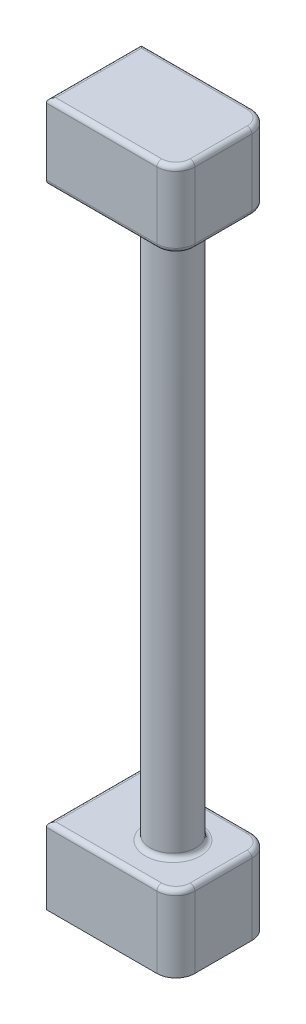
ISO-10303-21;
HEADER;
FILE_DESCRIPTION(('STEP AP214'),'2;1');
FILE_NAME('part.step','',(''),(''),'','','');
FILE_SCHEMA(('AUTOMOTIVE_DESIGN { 1 0 10303 214 1 1 1 1 }'));
ENDSEC;
DATA;
#1=APPLICATION_CONTEXT('core data for automotive mechanical design processes');
#2=APPLICATION_PROTOCOL_DEFINITION('international standard','automotive_design',2000,#1);
#3=PRODUCT_CONTEXT('',#1,'mechanical');
#4=PRODUCT('Part','Part','',(#3));
#5=PRODUCT_RELATED_PRODUCT_CATEGORY('part','',(#4));
#6=PRODUCT_DEFINITION_FORMATION('','',#4);
#7=PRODUCT_DEFINITION_CONTEXT('part definition',#1,'design');
#8=PRODUCT_DEFINITION('design','',#6,#7);
#9=PRODUCT_DEFINITION_SHAPE('','',#8);
#10=(LENGTH_UNIT() NAMED_UNIT(*) SI_UNIT(.MILLI.,.METRE.));
#11=(NAMED_UNIT(*) PLANE_ANGLE_UNIT() SI_UNIT($,.RADIAN.));
#12=(NAMED_UNIT(*) SI_UNIT($,.STERADIAN.) SOLID_ANGLE_UNIT());
#13=UNCERTAINTY_MEASURE_WITH_UNIT(LENGTH_MEASURE(1.E-05),#10,'distance_accuracy_value','');
#14=(GEOMETRIC_REPRESENTATION_CONTEXT(3) GLOBAL_UNCERTAINTY_ASSIGNED_CONTEXT((#13)) GLOBAL_UNIT_ASSIGNED_CONTEXT((#10,
#11,#12)) REPRESENTATION_CONTEXT('',''));
#15=CARTESIAN_POINT('',(0.,0.,0.));
#16=DIRECTION('',(0.,0.,1.));
#17=DIRECTION('',(1.,0.,0.));
#18=AXIS2_PLACEMENT_3D('',#15,#16,#17);
#19=CARTESIAN_POINT('',(0.,0.,0.));
#20=DIRECTION('',(0.,-1.,0.));
#21=DIRECTION('',(0.,0.,-1.));
#22=AXIS2_PLACEMENT_3D('',#19,#20,#21);
#23=CYLINDRICAL_SURFACE('',#22,12.);
#24=CARTESIAN_POINT('',(0.,42.5,0.));
#25=DIRECTION('',(0.,-1.,0.));
#26=DIRECTION('',(0.,0.,-1.));
#27=AXIS2_PLACEMENT_3D('',#24,#25,#26);
#28=CIRCLE('',#27,12.);
#29=CARTESIAN_POINT('',(0.,42.5,-12.));
#30=VERTEX_POINT('',#29);
#31=EDGE_CURVE('E293',#30,#30,#28,.F.);
#32=ORIENTED_EDGE('',*,*,#31,.T.);
#33=EDGE_LOOP('',(#32));
#34=FACE_BOUND('',#33,.T.);
#35=CARTESIAN_POINT('',(0.,327.5,0.));
#36=DIRECTION('',(0.,1.,0.));
#37=DIRECTION('',(0.,0.,1.));
#38=AXIS2_PLACEMENT_3D('',#35,#36,#37);
#39=CIRCLE('',#38,12.);
#40=CARTESIAN_POINT('',(0.,327.5,12.));
#41=VERTEX_POINT('',#40);
#42=EDGE_CURVE('E277',#41,#41,#39,.F.);
#43=ORIENTED_EDGE('',*,*,#42,.T.);
#44=EDGE_LOOP('',(#43));
#45=FACE_BOUND('',#44,.T.);
#46=ADVANCED_FACE('F32',(#34,#45),#23,.T.);
#47=CARTESIAN_POINT('',(-41.6342119381749,330.,25.));
#48=DIRECTION('',(-1.,0.,0.));
#49=DIRECTION('',(0.,0.,1.));
#50=AXIS2_PLACEMENT_3D('',#47,#48,#49);
#51=PLANE('',#50);
#52=DIRECTION('',(0.,1.,0.));
#53=VECTOR('',#52,1.);
#54=CARTESIAN_POINT('',(-41.6342119381749,330.,-25.));
#55=LINE('',#54,#53);
#56=CARTESIAN_POINT('',(-41.6342119381749,332.5,-25.));
#57=VERTEX_POINT('',#56);
#58=CARTESIAN_POINT('',(-41.6342119381749,367.5,-25.));
#59=VERTEX_POINT('',#58);
#60=EDGE_CURVE('E220',#57,#59,#55,.T.);
#61=ORIENTED_EDGE('',*,*,#60,.F.);
#62=DIRECTION('',(0.,0.,1.));
#63=VECTOR('',#62,1.);
#64=CARTESIAN_POINT('',(-41.6342119381749,332.5,25.));
#65=LINE('',#64,#63);
#66=CARTESIAN_POINT('',(-41.6342119381749,332.5,25.));
#67=VERTEX_POINT('',#66);
#68=EDGE_CURVE('E271',#57,#67,#65,.T.);
#69=ORIENTED_EDGE('',*,*,#68,.T.);
#70=DIRECTION('',(0.,1.,0.));
#71=VECTOR('',#70,1.);
#72=CARTESIAN_POINT('',(-41.6342119381749,330.,25.));
#73=LINE('',#72,#71);
#74=CARTESIAN_POINT('',(-41.6342119381749,367.5,25.));
#75=VERTEX_POINT('',#74);
#76=EDGE_CURVE('E216',#67,#75,#73,.T.);
#77=ORIENTED_EDGE('',*,*,#76,.T.);
#78=DIRECTION('',(0.,0.,1.));
#79=VECTOR('',#78,1.);
#80=CARTESIAN_POINT('',(-41.6342119381749,367.5,25.));
#81=LINE('',#80,#79);
#82=EDGE_CURVE('E269',#75,#59,#81,.F.);
#83=ORIENTED_EDGE('',*,*,#82,.T.);
#84=EDGE_LOOP('',(#61,#69,#77,#83));
#85=FACE_BOUND('',#84,.T.);
#86=ADVANCED_FACE('F406',(#85),#51,.T.);
#87=CARTESIAN_POINT('',(-31.7477646685832,330.,-25.));
#88=DIRECTION('',(0.,0.,-1.));
#89=DIRECTION('',(-1.,0.,0.));
#90=AXIS2_PLACEMENT_3D('',#87,#88,#89);
#91=PLANE('',#90);
#92=DIRECTION('',(0.,1.,0.));
#93=VECTOR('',#92,1.);
#94=CARTESIAN_POINT('',(16.5523568564973,330.,-25.));
#95=LINE('',#94,#93);
#96=CARTESIAN_POINT('',(16.5523568564973,332.5,-25.));
#97=VERTEX_POINT('',#96);
#98=CARTESIAN_POINT('',(16.5523568564973,367.5,-25.));
#99=VERTEX_POINT('',#98);
#100=EDGE_CURVE('E223',#97,#99,#95,.T.);
#101=ORIENTED_EDGE('',*,*,#100,.F.);
#102=DIRECTION('',(-1.,0.,0.));
#103=VECTOR('',#102,1.);
#104=CARTESIAN_POINT('',(-41.6342119381749,332.5,-25.));
#105=LINE('',#104,#103);
#106=EDGE_CURVE('E267',#97,#57,#105,.T.);
#107=ORIENTED_EDGE('',*,*,#106,.T.);
#108=ORIENTED_EDGE('',*,*,#60,.T.);
#109=DIRECTION('',(-1.,0.,0.));
#110=VECTOR('',#109,1.);
#111=CARTESIAN_POINT('',(-31.7477646685832,367.5,-25.));
#112=LINE('',#111,#110);
#113=EDGE_CURVE('E264',#59,#99,#112,.F.);
#114=ORIENTED_EDGE('',*,*,#113,.T.);
#115=EDGE_LOOP('',(#101,#107,#108,#114));
#116=FACE_BOUND('',#115,.T.);
#117=ADVANCED_FACE('F412',(#116),#91,.T.);
#118=CARTESIAN_POINT('',(16.5523568564973,330.,-15.));
#119=DIRECTION('',(0.,1.,0.));
#120=DIRECTION('',(0.,0.,1.));
#121=AXIS2_PLACEMENT_3D('',#118,#119,#120);
#122=CYLINDRICAL_SURFACE('',#121,10.);
#123=DIRECTION('',(0.,1.,0.));
#124=VECTOR('',#123,1.);
#125=CARTESIAN_POINT('',(26.5523568564973,330.,-14.9999999999999));
#126=LINE('',#125,#124);
#127=CARTESIAN_POINT('',(26.5523568564973,332.5,-14.9999999999999));
#128=VERTEX_POINT('',#127);
#129=CARTESIAN_POINT('',(26.5523568564973,367.5,-14.9999999999999));
#130=VERTEX_POINT('',#129);
#131=EDGE_CURVE('E226',#128,#130,#126,.T.);
#132=ORIENTED_EDGE('',*,*,#131,.F.);
#133=CARTESIAN_POINT('',(16.5523568564973,332.5,-15.));
#134=DIRECTION('',(0.,1.,0.));
#135=DIRECTION('',(0.,0.,1.));
#136=AXIS2_PLACEMENT_3D('',#133,#134,#135);
#137=CIRCLE('',#136,10.);
#138=EDGE_CURVE('E262',#128,#97,#137,.T.);
#139=ORIENTED_EDGE('',*,*,#138,.T.);
#140=ORIENTED_EDGE('',*,*,#100,.T.);
#141=CARTESIAN_POINT('',(16.5523568564973,367.5,-15.));
#142=DIRECTION('',(0.,1.,0.));
#143=DIRECTION('',(0.,0.,1.));
#144=AXIS2_PLACEMENT_3D('',#141,#142,#143);
#145=CIRCLE('',#144,10.);
#146=EDGE_CURVE('E260',#99,#130,#145,.F.);
#147=ORIENTED_EDGE('',*,*,#146,.T.);
#148=EDGE_LOOP('',(#132,#139,#140,#147));
#149=FACE_BOUND('',#148,.T.);
#150=ADVANCED_FACE('F681',(#149),#122,.T.);
#151=CARTESIAN_POINT('',(26.5523568564973,330.,-14.9999999999999));
#152=DIRECTION('',(1.,0.,0.));
#153=DIRECTION('',(0.,0.,-1.));
#154=AXIS2_PLACEMENT_3D('',#151,#152,#153);
#155=PLANE('',#154);
#156=DIRECTION('',(0.,1.,0.));
#157=VECTOR('',#156,1.);
#158=CARTESIAN_POINT('',(26.5523568564973,330.,14.9999999999999));
#159=LINE('',#158,#157);
#160=CARTESIAN_POINT('',(26.5523568564973,332.5,14.9999999999999));
#161=VERTEX_POINT('',#160);
#162=CARTESIAN_POINT('',(26.5523568564973,367.5,14.9999999999999));
#163=VERTEX_POINT('',#162);
#164=EDGE_CURVE('E229',#161,#163,#159,.T.);
#165=ORIENTED_EDGE('',*,*,#164,.F.);
#166=DIRECTION('',(0.,0.,-1.));
#167=VECTOR('',#166,1.);
#168=CARTESIAN_POINT('',(26.5523568564973,332.5,-14.9999999999999));
#169=LINE('',#168,#167);
#170=EDGE_CURVE('E258',#161,#128,#169,.T.);
#171=ORIENTED_EDGE('',*,*,#170,.T.);
#172=ORIENTED_EDGE('',*,*,#131,.T.);
#173=DIRECTION('',(0.,0.,-1.));
#174=VECTOR('',#173,1.);
#175=CARTESIAN_POINT('',(26.5523568564973,367.5,-14.9999999999999));
#176=LINE('',#175,#174);
#177=EDGE_CURVE('E256',#130,#163,#176,.F.);
#178=ORIENTED_EDGE('',*,*,#177,.T.);
#179=EDGE_LOOP('',(#165,#171,#172,#178));
#180=FACE_BOUND('',#179,.T.);
#181=ADVANCED_FACE('F671',(#180),#155,.T.);
#182=CARTESIAN_POINT('',(16.5523568564973,330.,15.));
#183=DIRECTION('',(0.,1.,0.));
#184=DIRECTION('',(0.,0.,1.));
#185=AXIS2_PLACEMENT_3D('',#182,#183,#184);
#186=CYLINDRICAL_SURFACE('',#185,10.);
#187=DIRECTION('',(0.,1.,0.));
#188=VECTOR('',#187,1.);
#189=CARTESIAN_POINT('',(16.5523568564973,330.,25.));
#190=LINE('',#189,#188);
#191=CARTESIAN_POINT('',(16.5523568564973,332.5,25.));
#192=VERTEX_POINT('',#191);
#193=CARTESIAN_POINT('',(16.5523568564973,367.5,25.));
#194=VERTEX_POINT('',#193);
#195=EDGE_CURVE('E232',#192,#194,#190,.T.);
#196=ORIENTED_EDGE('',*,*,#195,.F.);
#197=CARTESIAN_POINT('',(16.5523568564973,332.5,15.));
#198=DIRECTION('',(0.,1.,0.));
#199=DIRECTION('',(0.,0.,1.));
#200=AXIS2_PLACEMENT_3D('',#197,#198,#199);
#201=CIRCLE('',#200,10.);
#202=EDGE_CURVE('E237',#192,#161,#201,.T.);
#203=ORIENTED_EDGE('',*,*,#202,.T.);
#204=ORIENTED_EDGE('',*,*,#164,.T.);
#205=CARTESIAN_POINT('',(16.5523568564973,367.5,15.));
#206=DIRECTION('',(0.,1.,0.));
#207=DIRECTION('',(0.,0.,1.));
#208=AXIS2_PLACEMENT_3D('',#205,#206,#207);
#209=CIRCLE('',#208,10.);
#210=EDGE_CURVE('E219',#163,#194,#209,.F.);
#211=ORIENTED_EDGE('',*,*,#210,.T.);
#212=EDGE_LOOP('',(#196,#203,#204,#211));
#213=FACE_BOUND('',#212,.T.);
#214=ADVANCED_FACE('F661',(#213),#186,.T.);
#215=CARTESIAN_POINT('',(-31.7477646685832,330.,25.));
#216=DIRECTION('',(0.,0.,1.));
#217=DIRECTION('',(1.,0.,0.));
#218=AXIS2_PLACEMENT_3D('',#215,#216,#217);
#219=PLANE('',#218);
#220=ORIENTED_EDGE('',*,*,#76,.F.);
#221=DIRECTION('',(1.,0.,0.));
#222=VECTOR('',#221,1.);
#223=CARTESIAN_POINT('',(16.5523568564973,332.5,25.));
#224=LINE('',#223,#222);
#225=EDGE_CURVE('E275',#67,#192,#224,.T.);
#226=ORIENTED_EDGE('',*,*,#225,.T.);
#227=ORIENTED_EDGE('',*,*,#195,.T.);
#228=DIRECTION('',(1.,0.,0.));
#229=VECTOR('',#228,1.);
#230=CARTESIAN_POINT('',(-31.7477646685832,367.5,25.));
#231=LINE('',#230,#229);
#232=EDGE_CURVE('E273',#194,#75,#231,.F.);
#233=ORIENTED_EDGE('',*,*,#232,.T.);
#234=EDGE_LOOP('',(#220,#226,#227,#233));
#235=FACE_BOUND('',#234,.T.);
#236=ADVANCED_FACE('F651',(#235),#219,.T.);
#237=CARTESIAN_POINT('',(16.5523568564973,330.,-15.));
#238=DIRECTION('',(0.,1.,0.));
#239=DIRECTION('',(0.,0.,1.));
#240=AXIS2_PLACEMENT_3D('',#237,#238,#239);
#241=PLANE('',#240);
#242=DIRECTION('',(0.,0.,-1.));
#243=VECTOR('',#242,1.);
#244=CARTESIAN_POINT('',(24.0523568564973,330.,14.9999999999999));
#245=LINE('',#244,#243);
#246=CARTESIAN_POINT('',(24.0523568564973,330.,-14.9999999999999));
#247=VERTEX_POINT('',#246);
#248=CARTESIAN_POINT('',(24.0523568564973,330.,14.9999999999999));
#249=VERTEX_POINT('',#248);
#250=EDGE_CURVE('E251',#247,#249,#245,.F.);
#251=ORIENTED_EDGE('',*,*,#250,.T.);
#252=CARTESIAN_POINT('',(16.5523568564973,330.,15.));
#253=DIRECTION('',(0.,1.,0.));
#254=DIRECTION('',(0.,0.,1.));
#255=AXIS2_PLACEMENT_3D('',#252,#253,#254);
#256=CIRCLE('',#255,7.5);
#257=CARTESIAN_POINT('',(16.5523568564973,330.,22.5));
#258=VERTEX_POINT('',#257);
#259=EDGE_CURVE('E253',#249,#258,#256,.F.);
#260=ORIENTED_EDGE('',*,*,#259,.T.);
#261=DIRECTION('',(1.,0.,0.));
#262=VECTOR('',#261,1.);
#263=CARTESIAN_POINT('',(-41.6342119381749,330.,22.5));
#264=LINE('',#263,#262);
#265=CARTESIAN_POINT('',(-39.1342119381748,330.,22.5));
#266=VERTEX_POINT('',#265);
#267=EDGE_CURVE('E243',#258,#266,#264,.F.);
#268=ORIENTED_EDGE('',*,*,#267,.T.);
#269=DIRECTION('',(0.,0.,1.));
#270=VECTOR('',#269,1.);
#271=CARTESIAN_POINT('',(-39.1342119381748,330.,-25.));
#272=LINE('',#271,#270);
#273=CARTESIAN_POINT('',(-39.1342119381748,330.,-22.5));
#274=VERTEX_POINT('',#273);
#275=EDGE_CURVE('E245',#266,#274,#272,.F.);
#276=ORIENTED_EDGE('',*,*,#275,.T.);
#277=DIRECTION('',(-1.,0.,0.));
#278=VECTOR('',#277,1.);
#279=CARTESIAN_POINT('',(16.5523568564973,330.,-22.5));
#280=LINE('',#279,#278);
#281=CARTESIAN_POINT('',(16.5523568564973,330.,-22.5));
#282=VERTEX_POINT('',#281);
#283=EDGE_CURVE('E247',#274,#282,#280,.F.);
#284=ORIENTED_EDGE('',*,*,#283,.T.);
#285=CARTESIAN_POINT('',(16.5523568564973,330.,-15.));
#286=DIRECTION('',(0.,1.,0.));
#287=DIRECTION('',(0.,0.,1.));
#288=AXIS2_PLACEMENT_3D('',#285,#286,#287);
#289=CIRCLE('',#288,7.5);
#290=EDGE_CURVE('E249',#282,#247,#289,.F.);
#291=ORIENTED_EDGE('',*,*,#290,.T.);
#292=EDGE_LOOP('',(#251,#260,#268,#276,#284,#291));
#293=FACE_BOUND('',#292,.T.);
#294=CARTESIAN_POINT('',(0.,330.,0.));
#295=DIRECTION('',(0.,1.,0.));
#296=DIRECTION('',(0.,0.,1.));
#297=AXIS2_PLACEMENT_3D('',#294,#295,#296);
#298=CIRCLE('',#297,14.5);
#299=CARTESIAN_POINT('',(0.,330.,14.5));
#300=VERTEX_POINT('',#299);
#301=EDGE_CURVE('E240',#300,#300,#298,.T.);
#302=ORIENTED_EDGE('',*,*,#301,.T.);
#303=EDGE_LOOP('',(#302));
#304=FACE_BOUND('',#303,.T.);
#305=ADVANCED_FACE('F641',(#293,#304),#241,.F.);
#306=CARTESIAN_POINT('',(12.,370.,0.));
#307=DIRECTION('',(0.,1.,0.));
#308=DIRECTION('',(0.,0.,1.));
#309=AXIS2_PLACEMENT_3D('',#306,#307,#308);
#310=PLANE('',#309);
#311=CARTESIAN_POINT('',(16.5523568564973,370.,-15.));
#312=DIRECTION('',(0.,1.,0.));
#313=DIRECTION('',(0.,0.,1.));
#314=AXIS2_PLACEMENT_3D('',#311,#312,#313);
#315=CIRCLE('',#314,7.5);
#316=CARTESIAN_POINT('',(24.0523568564973,370.,-15.));
#317=VERTEX_POINT('',#316);
#318=CARTESIAN_POINT('',(16.5523568564973,370.,-22.5));
#319=VERTEX_POINT('',#318);
#320=EDGE_CURVE('E288',#317,#319,#315,.T.);
#321=ORIENTED_EDGE('',*,*,#320,.T.);
#322=DIRECTION('',(-1.,0.,0.));
#323=VECTOR('',#322,1.);
#324=CARTESIAN_POINT('',(12.,370.,-22.5));
#325=LINE('',#324,#323);
#326=CARTESIAN_POINT('',(-39.1342119381748,370.,-22.5));
#327=VERTEX_POINT('',#326);
#328=EDGE_CURVE('E290',#319,#327,#325,.T.);
#329=ORIENTED_EDGE('',*,*,#328,.T.);
#330=DIRECTION('',(0.,0.,1.));
#331=VECTOR('',#330,1.);
#332=CARTESIAN_POINT('',(-39.1342119381748,370.,0.));
#333=LINE('',#332,#331);
#334=CARTESIAN_POINT('',(-39.1342119381748,370.,22.5));
#335=VERTEX_POINT('',#334);
#336=EDGE_CURVE('E280',#327,#335,#333,.T.);
#337=ORIENTED_EDGE('',*,*,#336,.T.);
#338=DIRECTION('',(1.,0.,0.));
#339=VECTOR('',#338,1.);
#340=CARTESIAN_POINT('',(12.,370.,22.5));
#341=LINE('',#340,#339);
#342=CARTESIAN_POINT('',(16.5523568564973,370.,22.5));
#343=VERTEX_POINT('',#342);
#344=EDGE_CURVE('E282',#335,#343,#341,.T.);
#345=ORIENTED_EDGE('',*,*,#344,.T.);
#346=CARTESIAN_POINT('',(16.5523568564973,370.,15.));
#347=DIRECTION('',(0.,1.,0.));
#348=DIRECTION('',(0.,0.,1.));
#349=AXIS2_PLACEMENT_3D('',#346,#347,#348);
#350=CIRCLE('',#349,7.5);
#351=CARTESIAN_POINT('',(24.0523568564973,370.,14.9999999999999));
#352=VERTEX_POINT('',#351);
#353=EDGE_CURVE('E284',#343,#352,#350,.T.);
#354=ORIENTED_EDGE('',*,*,#353,.T.);
#355=DIRECTION('',(0.,0.,-1.));
#356=VECTOR('',#355,1.);
#357=CARTESIAN_POINT('',(24.0523568564973,370.,0.));
#358=LINE('',#357,#356);
#359=EDGE_CURVE('E286',#352,#317,#358,.T.);
#360=ORIENTED_EDGE('',*,*,#359,.T.);
#361=EDGE_LOOP('',(#321,#329,#337,#345,#354,#360));
#362=FACE_BOUND('',#361,.T.);
#363=ADVANCED_FACE('F418',(#362),#310,.T.);
#364=CARTESIAN_POINT('',(-31.7477646685832,332.5,-22.5));
#365=DIRECTION('',(1.,0.,0.));
#366=DIRECTION('',(0.,0.,-1.));
#367=AXIS2_PLACEMENT_3D('',#364,#365,#366);
#368=CYLINDRICAL_SURFACE('',#367,2.5);
#369=CARTESIAN_POINT('',(16.5523568564973,332.5,-22.5));
#370=DIRECTION('',(1.,0.,0.));
#371=DIRECTION('',(0.,0.,-1.));
#372=AXIS2_PLACEMENT_3D('',#369,#370,#371);
#373=CIRCLE('',#372,2.5);
#374=EDGE_CURVE('E305',#282,#97,#373,.T.);
#375=ORIENTED_EDGE('',*,*,#374,.F.);
#376=ORIENTED_EDGE('',*,*,#283,.F.);
#377=CARTESIAN_POINT('',(-39.1342119381748,332.5,-22.5));
#378=DIRECTION('',(0.707106781186547,0.,-0.707106781186547));
#379=DIRECTION('',(-0.707106781186547,0.,-0.707106781186547));
#380=AXIS2_PLACEMENT_3D('',#377,#378,#379);
#381=ELLIPSE('',#380,3.53553390593274,2.5);
#382=EDGE_CURVE('E235',#57,#274,#381,.F.);
#383=ORIENTED_EDGE('',*,*,#382,.F.);
#384=ORIENTED_EDGE('',*,*,#106,.F.);
#385=EDGE_LOOP('',(#375,#376,#383,#384));
#386=FACE_BOUND('',#385,.T.);
#387=ADVANCED_FACE('F443',(#386),#368,.T.);
#388=CARTESIAN_POINT('',(-39.1342119381748,332.5,25.));
#389=DIRECTION('',(0.,0.,-1.));
#390=DIRECTION('',(-1.,0.,0.));
#391=AXIS2_PLACEMENT_3D('',#388,#389,#390);
#392=CYLINDRICAL_SURFACE('',#391,2.5);
#393=ORIENTED_EDGE('',*,*,#382,.T.);
#394=ORIENTED_EDGE('',*,*,#275,.F.);
#395=CARTESIAN_POINT('',(-39.1342119381748,332.5,22.5));
#396=DIRECTION('',(-0.707106781186547,0.,-0.707106781186547));
#397=DIRECTION('',(-0.707106781186548,0.,0.707106781186547));
#398=AXIS2_PLACEMENT_3D('',#395,#396,#397);
#399=ELLIPSE('',#398,3.53553390593274,2.5);
#400=EDGE_CURVE('E302',#67,#266,#399,.F.);
#401=ORIENTED_EDGE('',*,*,#400,.F.);
#402=ORIENTED_EDGE('',*,*,#68,.F.);
#403=EDGE_LOOP('',(#393,#394,#401,#402));
#404=FACE_BOUND('',#403,.T.);
#405=ADVANCED_FACE('F439',(#404),#392,.T.);
#406=CARTESIAN_POINT('',(16.5523568564973,332.5,-15.));
#407=DIRECTION('',(0.,1.,0.));
#408=DIRECTION('',(0.,0.,1.));
#409=AXIS2_PLACEMENT_3D('',#406,#407,#408);
#410=TOROIDAL_SURFACE('',#409,7.5,2.5);
#411=ORIENTED_EDGE('',*,*,#374,.T.);
#412=ORIENTED_EDGE('',*,*,#138,.F.);
#413=CARTESIAN_POINT('',(24.0523568564973,332.5,-14.9999999999999));
#414=DIRECTION('',(0.,0.,1.));
#415=DIRECTION('',(1.,0.,0.));
#416=AXIS2_PLACEMENT_3D('',#413,#414,#415);
#417=CIRCLE('',#416,2.5);
#418=EDGE_CURVE('E299',#247,#128,#417,.T.);
#419=ORIENTED_EDGE('',*,*,#418,.F.);
#420=ORIENTED_EDGE('',*,*,#290,.F.);
#421=EDGE_LOOP('',(#411,#412,#419,#420));
#422=FACE_BOUND('',#421,.T.);
#423=ADVANCED_FACE('F435',(#422),#410,.T.);
#424=CARTESIAN_POINT('',(-31.7477646685832,332.5,22.5));
#425=DIRECTION('',(-1.,0.,0.));
#426=DIRECTION('',(0.,0.,1.));
#427=AXIS2_PLACEMENT_3D('',#424,#425,#426);
#428=CYLINDRICAL_SURFACE('',#427,2.5);
#429=ORIENTED_EDGE('',*,*,#400,.T.);
#430=ORIENTED_EDGE('',*,*,#267,.F.);
#431=CARTESIAN_POINT('',(16.5523568564973,332.5,22.5));
#432=DIRECTION('',(1.,0.,0.));
#433=DIRECTION('',(0.,1.,0.));
#434=AXIS2_PLACEMENT_3D('',#431,#432,#433);
#435=CIRCLE('',#434,2.5);
#436=EDGE_CURVE('E296',#192,#258,#435,.T.);
#437=ORIENTED_EDGE('',*,*,#436,.F.);
#438=ORIENTED_EDGE('',*,*,#225,.F.);
#439=EDGE_LOOP('',(#429,#430,#437,#438));
#440=FACE_BOUND('',#439,.T.);
#441=ADVANCED_FACE('F431',(#440),#428,.T.);
#442=CARTESIAN_POINT('',(24.0523568564973,332.5,-14.9999999999999));
#443=DIRECTION('',(0.,0.,1.));
#444=DIRECTION('',(1.,0.,0.));
#445=AXIS2_PLACEMENT_3D('',#442,#443,#444);
#446=CYLINDRICAL_SURFACE('',#445,2.5);
#447=ORIENTED_EDGE('',*,*,#418,.T.);
#448=ORIENTED_EDGE('',*,*,#170,.F.);
#449=CARTESIAN_POINT('',(24.0523568564973,332.5,14.9999999999999));
#450=DIRECTION('',(0.,0.,1.));
#451=DIRECTION('',(1.,0.,0.));
#452=AXIS2_PLACEMENT_3D('',#449,#450,#451);
#453=CIRCLE('',#452,2.5);
#454=EDGE_CURVE('E294',#249,#161,#453,.T.);
#455=ORIENTED_EDGE('',*,*,#454,.F.);
#456=ORIENTED_EDGE('',*,*,#250,.F.);
#457=EDGE_LOOP('',(#447,#448,#455,#456));
#458=FACE_BOUND('',#457,.T.);
#459=ADVANCED_FACE('F427',(#458),#446,.T.);
#460=CARTESIAN_POINT('',(16.5523568564973,332.5,15.));
#461=DIRECTION('',(0.,1.,0.));
#462=DIRECTION('',(0.,0.,1.));
#463=AXIS2_PLACEMENT_3D('',#460,#461,#462);
#464=TOROIDAL_SURFACE('',#463,7.5,2.5);
#465=ORIENTED_EDGE('',*,*,#436,.T.);
#466=ORIENTED_EDGE('',*,*,#259,.F.);
#467=ORIENTED_EDGE('',*,*,#454,.T.);
#468=ORIENTED_EDGE('',*,*,#202,.F.);
#469=EDGE_LOOP('',(#465,#466,#467,#468));
#470=FACE_BOUND('',#469,.T.);
#471=ADVANCED_FACE('F423',(#470),#464,.T.);
#472=CARTESIAN_POINT('',(0.,327.5,0.));
#473=DIRECTION('',(0.,1.,0.));
#474=DIRECTION('',(0.,0.,1.));
#475=AXIS2_PLACEMENT_3D('',#472,#473,#474);
#476=TOROIDAL_SURFACE('',#475,14.5,2.5);
#477=ORIENTED_EDGE('',*,*,#42,.F.);
#478=EDGE_LOOP('',(#477));
#479=FACE_BOUND('',#478,.T.);
#480=ORIENTED_EDGE('',*,*,#301,.F.);
#481=EDGE_LOOP('',(#480));
#482=FACE_BOUND('',#481,.T.);
#483=ADVANCED_FACE('F426',(#479,#482),#476,.F.);
#484=CARTESIAN_POINT('',(16.5523568564973,367.5,15.));
#485=DIRECTION('',(0.,1.,0.));
#486=DIRECTION('',(0.,0.,1.));
#487=AXIS2_PLACEMENT_3D('',#484,#485,#486);
#488=TOROIDAL_SURFACE('',#487,7.5,2.5);
#489=CARTESIAN_POINT('',(16.5523568564973,367.5,22.5));
#490=DIRECTION('',(-1.,0.,0.));
#491=DIRECTION('',(0.,0.,1.));
#492=AXIS2_PLACEMENT_3D('',#489,#490,#491);
#493=CIRCLE('',#492,2.5);
#494=EDGE_CURVE('E319',#194,#343,#493,.T.);
#495=ORIENTED_EDGE('',*,*,#494,.F.);
#496=ORIENTED_EDGE('',*,*,#210,.F.);
#497=CARTESIAN_POINT('',(24.0523568564973,367.5,14.9999999999999));
#498=DIRECTION('',(0.,0.,-1.));
#499=DIRECTION('',(-1.,0.,0.));
#500=AXIS2_PLACEMENT_3D('',#497,#498,#499);
#501=CIRCLE('',#500,2.5);
#502=EDGE_CURVE('E297',#352,#163,#501,.T.);
#503=ORIENTED_EDGE('',*,*,#502,.F.);
#504=ORIENTED_EDGE('',*,*,#353,.F.);
#505=EDGE_LOOP('',(#495,#496,#503,#504));
#506=FACE_BOUND('',#505,.T.);
#507=ADVANCED_FACE('F450',(#506),#488,.T.);
#508=CARTESIAN_POINT('',(24.0523568564973,367.5,0.));
#509=DIRECTION('',(0.,0.,-1.));
#510=DIRECTION('',(-1.,0.,0.));
#511=AXIS2_PLACEMENT_3D('',#508,#509,#510);
#512=CYLINDRICAL_SURFACE('',#511,2.5);
#513=ORIENTED_EDGE('',*,*,#502,.T.);
#514=ORIENTED_EDGE('',*,*,#177,.F.);
#515=CARTESIAN_POINT('',(24.0523568564973,367.5,-15.));
#516=DIRECTION('',(0.,0.,-1.));
#517=DIRECTION('',(-1.,0.,0.));
#518=AXIS2_PLACEMENT_3D('',#515,#516,#517);
#519=CIRCLE('',#518,2.5);
#520=EDGE_CURVE('E316',#317,#130,#519,.T.);
#521=ORIENTED_EDGE('',*,*,#520,.F.);
#522=ORIENTED_EDGE('',*,*,#359,.F.);
#523=EDGE_LOOP('',(#513,#514,#521,#522));
#524=FACE_BOUND('',#523,.T.);
#525=ADVANCED_FACE('F468',(#524),#512,.T.);
#526=CARTESIAN_POINT('',(12.,367.5,22.5));
#527=DIRECTION('',(1.,0.,0.));
#528=DIRECTION('',(0.,0.,-1.));
#529=AXIS2_PLACEMENT_3D('',#526,#527,#528);
#530=CYLINDRICAL_SURFACE('',#529,2.5);
#531=ORIENTED_EDGE('',*,*,#494,.T.);
#532=ORIENTED_EDGE('',*,*,#344,.F.);
#533=CARTESIAN_POINT('',(-39.1342119381748,367.5,22.5));
#534=DIRECTION('',(0.707106781186547,0.,0.707106781186547));
#535=DIRECTION('',(-0.707106781186548,0.,0.707106781186547));
#536=AXIS2_PLACEMENT_3D('',#533,#534,#535);
#537=ELLIPSE('',#536,3.53553390593274,2.5);
#538=EDGE_CURVE('E313',#75,#335,#537,.F.);
#539=ORIENTED_EDGE('',*,*,#538,.F.);
#540=ORIENTED_EDGE('',*,*,#232,.F.);
#541=EDGE_LOOP('',(#531,#532,#539,#540));
#542=FACE_BOUND('',#541,.T.);
#543=ADVANCED_FACE('F464',(#542),#530,.T.);
#544=CARTESIAN_POINT('',(16.5523568564973,367.5,-15.));
#545=DIRECTION('',(0.,1.,0.));
#546=DIRECTION('',(0.,0.,1.));
#547=AXIS2_PLACEMENT_3D('',#544,#545,#546);
#548=TOROIDAL_SURFACE('',#547,7.5,2.5);
#549=ORIENTED_EDGE('',*,*,#520,.T.);
#550=ORIENTED_EDGE('',*,*,#146,.F.);
#551=CARTESIAN_POINT('',(16.5523568564973,367.5,-22.5));
#552=DIRECTION('',(-1.,0.,0.));
#553=DIRECTION('',(0.,0.,1.));
#554=AXIS2_PLACEMENT_3D('',#551,#552,#553);
#555=CIRCLE('',#554,2.5);
#556=EDGE_CURVE('E311',#319,#99,#555,.T.);
#557=ORIENTED_EDGE('',*,*,#556,.F.);
#558=ORIENTED_EDGE('',*,*,#320,.F.);
#559=EDGE_LOOP('',(#549,#550,#557,#558));
#560=FACE_BOUND('',#559,.T.);
#561=ADVANCED_FACE('F460',(#560),#548,.T.);
#562=CARTESIAN_POINT('',(-39.1342119381748,367.5,0.));
#563=DIRECTION('',(0.,0.,1.));
#564=DIRECTION('',(1.,0.,0.));
#565=AXIS2_PLACEMENT_3D('',#562,#563,#564);
#566=CYLINDRICAL_SURFACE('',#565,2.5);
#567=ORIENTED_EDGE('',*,*,#538,.T.);
#568=ORIENTED_EDGE('',*,*,#336,.F.);
#569=CARTESIAN_POINT('',(-39.1342119381748,367.5,-22.5));
#570=DIRECTION('',(-0.707106781186547,0.,0.707106781186547));
#571=DIRECTION('',(0.707106781186547,0.,0.707106781186547));
#572=AXIS2_PLACEMENT_3D('',#569,#570,#571);
#573=ELLIPSE('',#572,3.53553390593274,2.5);
#574=EDGE_CURVE('E208',#59,#327,#573,.F.);
#575=ORIENTED_EDGE('',*,*,#574,.F.);
#576=ORIENTED_EDGE('',*,*,#82,.F.);
#577=EDGE_LOOP('',(#567,#568,#575,#576));
#578=FACE_BOUND('',#577,.T.);
#579=ADVANCED_FACE('F456',(#578),#566,.T.);
#580=CARTESIAN_POINT('',(12.,367.5,-22.5));
#581=DIRECTION('',(-1.,0.,0.));
#582=DIRECTION('',(0.,0.,1.));
#583=AXIS2_PLACEMENT_3D('',#580,#581,#582);
#584=CYLINDRICAL_SURFACE('',#583,2.5);
#585=ORIENTED_EDGE('',*,*,#556,.T.);
#586=ORIENTED_EDGE('',*,*,#113,.F.);
#587=ORIENTED_EDGE('',*,*,#574,.T.);
#588=ORIENTED_EDGE('',*,*,#328,.F.);
#589=EDGE_LOOP('',(#585,#586,#587,#588));
#590=FACE_BOUND('',#589,.T.);
#591=ADVANCED_FACE('F452',(#590),#584,.T.);
#592=CARTESIAN_POINT('',(16.5523568564973,40.,-15.));
#593=DIRECTION('',(0.,-1.,0.));
#594=DIRECTION('',(0.,0.,1.));
#595=AXIS2_PLACEMENT_3D('',#592,#593,#594);
#596=PLANE('',#595);
#597=CARTESIAN_POINT('',(0.,40.,0.));
#598=DIRECTION('',(0.,-1.,0.));
#599=DIRECTION('',(0.,0.,-1.));
#600=AXIS2_PLACEMENT_3D('',#597,#598,#599);
#601=CIRCLE('',#600,14.5);
#602=CARTESIAN_POINT('',(0.,40.,-14.5));
#603=VERTEX_POINT('',#602);
#604=EDGE_CURVE('E339',#603,#603,#601,.T.);
#605=ORIENTED_EDGE('',*,*,#604,.T.);
#606=EDGE_LOOP('',(#605));
#607=FACE_BOUND('',#606,.T.);
#608=DIRECTION('',(-1.,0.,0.));
#609=VECTOR('',#608,1.);
#610=CARTESIAN_POINT('',(16.5523568564973,40.,-22.5));
#611=LINE('',#610,#609);
#612=CARTESIAN_POINT('',(16.5523568564973,40.,-22.5));
#613=VERTEX_POINT('',#612);
#614=CARTESIAN_POINT('',(-39.1342119381748,40.,-22.5));
#615=VERTEX_POINT('',#614);
#616=EDGE_CURVE('E334',#613,#615,#611,.T.);
#617=ORIENTED_EDGE('',*,*,#616,.T.);
#618=DIRECTION('',(0.,0.,1.));
#619=VECTOR('',#618,1.);
#620=CARTESIAN_POINT('',(-39.1342119381748,40.,-15.));
#621=LINE('',#620,#619);
#622=CARTESIAN_POINT('',(-39.1342119381748,40.,22.5));
#623=VERTEX_POINT('',#622);
#624=EDGE_CURVE('E336',#615,#623,#621,.T.);
#625=ORIENTED_EDGE('',*,*,#624,.T.);
#626=DIRECTION('',(1.,0.,0.));
#627=VECTOR('',#626,1.);
#628=CARTESIAN_POINT('',(16.5523568564973,40.,22.5));
#629=LINE('',#628,#627);
#630=CARTESIAN_POINT('',(16.5523568564973,40.,22.5));
#631=VERTEX_POINT('',#630);
#632=EDGE_CURVE('E326',#623,#631,#629,.T.);
#633=ORIENTED_EDGE('',*,*,#632,.T.);
#634=CARTESIAN_POINT('',(16.5523568564973,40.,15.));
#635=DIRECTION('',(0.,-1.,0.));
#636=DIRECTION('',(0.,0.,-1.));
#637=AXIS2_PLACEMENT_3D('',#634,#635,#636);
#638=CIRCLE('',#637,7.5);
#639=CARTESIAN_POINT('',(24.0523568564973,40.,14.9999999999999));
#640=VERTEX_POINT('',#639);
#641=EDGE_CURVE('E328',#631,#640,#638,.F.);
#642=ORIENTED_EDGE('',*,*,#641,.T.);
#643=DIRECTION('',(0.,0.,-1.));
#644=VECTOR('',#643,1.);
#645=CARTESIAN_POINT('',(24.0523568564973,40.,-15.));
#646=LINE('',#645,#644);
#647=CARTESIAN_POINT('',(24.0523568564973,40.,-15.));
#648=VERTEX_POINT('',#647);
#649=EDGE_CURVE('E330',#640,#648,#646,.T.);
#650=ORIENTED_EDGE('',*,*,#649,.T.);
#651=CARTESIAN_POINT('',(16.5523568564973,40.,-15.));
#652=DIRECTION('',(0.,-1.,0.));
#653=DIRECTION('',(0.,0.,-1.));
#654=AXIS2_PLACEMENT_3D('',#651,#652,#653);
#655=CIRCLE('',#654,7.5);
#656=EDGE_CURVE('E332',#648,#613,#655,.F.);
#657=ORIENTED_EDGE('',*,*,#656,.T.);
#658=EDGE_LOOP('',(#617,#625,#633,#642,#650,#657));
#659=FACE_BOUND('',#658,.T.);
#660=ADVANCED_FACE('F455',(#607,#659),#596,.F.);
#661=CARTESIAN_POINT('',(-31.7477646685832,40.,25.));
#662=DIRECTION('',(0.,0.,-1.));
#663=DIRECTION('',(-1.,0.,0.));
#664=AXIS2_PLACEMENT_3D('',#661,#662,#663);
#665=PLANE('',#664);
#666=DIRECTION('',(0.,-1.,0.));
#667=VECTOR('',#666,1.);
#668=CARTESIAN_POINT('',(16.5523568564973,40.,25.));
#669=LINE('',#668,#667);
#670=CARTESIAN_POINT('',(16.5523568564973,37.5,25.));
#671=VERTEX_POINT('',#670);
#672=CARTESIAN_POINT('',(16.5523568564973,0.,25.));
#673=VERTEX_POINT('',#672);
#674=EDGE_CURVE('E206',#671,#673,#669,.T.);
#675=ORIENTED_EDGE('',*,*,#674,.F.);
#676=DIRECTION('',(1.,0.,0.));
#677=VECTOR('',#676,1.);
#678=CARTESIAN_POINT('',(-31.7477646685832,37.5,25.));
#679=LINE('',#678,#677);
#680=CARTESIAN_POINT('',(-41.6342119381749,37.5,25.));
#681=VERTEX_POINT('',#680);
#682=EDGE_CURVE('E11',#671,#681,#679,.F.);
#683=ORIENTED_EDGE('',*,*,#682,.T.);
#684=DIRECTION('',(0.,-1.,0.));
#685=VECTOR('',#684,1.);
#686=CARTESIAN_POINT('',(-41.6342119381749,40.,25.));
#687=LINE('',#686,#685);
#688=CARTESIAN_POINT('',(-41.6342119381749,0.,25.));
#689=VERTEX_POINT('',#688);
#690=EDGE_CURVE('E176',#681,#689,#687,.T.);
#691=ORIENTED_EDGE('',*,*,#690,.T.);
#692=DIRECTION('',(1.,0.,0.));
#693=VECTOR('',#692,1.);
#694=CARTESIAN_POINT('',(-31.7477646685832,0.,25.));
#695=LINE('',#694,#693);
#696=EDGE_CURVE('E180',#689,#673,#695,.T.);
#697=ORIENTED_EDGE('',*,*,#696,.T.);
#698=EDGE_LOOP('',(#675,#683,#691,#697));
#699=FACE_BOUND('',#698,.T.);
#700=ADVANCED_FACE('F178',(#699),#665,.F.);
#701=CARTESIAN_POINT('',(16.5523568564973,40.,15.));
#702=DIRECTION('',(0.,-1.,0.));
#703=DIRECTION('',(0.,0.,-1.));
#704=AXIS2_PLACEMENT_3D('',#701,#702,#703);
#705=CYLINDRICAL_SURFACE('',#704,10.);
#706=DIRECTION('',(0.,-1.,0.));
#707=VECTOR('',#706,1.);
#708=CARTESIAN_POINT('',(26.5523568564973,40.,14.9999999999999));
#709=LINE('',#708,#707);
#710=CARTESIAN_POINT('',(26.5523568564973,37.5,14.9999999999999));
#711=VERTEX_POINT('',#710);
#712=CARTESIAN_POINT('',(26.5523568564973,0.,14.9999999999999));
#713=VERTEX_POINT('',#712);
#714=EDGE_CURVE('E209',#711,#713,#709,.T.);
#715=ORIENTED_EDGE('',*,*,#714,.F.);
#716=CARTESIAN_POINT('',(16.5523568564973,37.5,15.));
#717=DIRECTION('',(0.,-1.,0.));
#718=DIRECTION('',(0.,0.,-1.));
#719=AXIS2_PLACEMENT_3D('',#716,#717,#718);
#720=CIRCLE('',#719,10.);
#721=EDGE_CURVE('E41',#711,#671,#720,.T.);
#722=ORIENTED_EDGE('',*,*,#721,.T.);
#723=ORIENTED_EDGE('',*,*,#674,.T.);
#724=CARTESIAN_POINT('',(16.5523568564973,0.,15.));
#725=DIRECTION('',(0.,1.,0.));
#726=DIRECTION('',(0.,0.,-1.));
#727=AXIS2_PLACEMENT_3D('',#724,#725,#726);
#728=CIRCLE('',#727,10.);
#729=EDGE_CURVE('E200',#673,#713,#728,.T.);
#730=ORIENTED_EDGE('',*,*,#729,.T.);
#731=EDGE_LOOP('',(#715,#722,#723,#730));
#732=FACE_BOUND('',#731,.T.);
#733=ADVANCED_FACE('F403',(#732),#705,.T.);
#734=CARTESIAN_POINT('',(26.5523568564973,40.,-14.9999999999999));
#735=DIRECTION('',(-1.,0.,0.));
#736=DIRECTION('',(0.,0.,1.));
#737=AXIS2_PLACEMENT_3D('',#734,#735,#736);
#738=PLANE('',#737);
#739=DIRECTION('',(0.,-1.,0.));
#740=VECTOR('',#739,1.);
#741=CARTESIAN_POINT('',(26.5523568564973,40.,-14.9999999999999));
#742=LINE('',#741,#740);
#743=CARTESIAN_POINT('',(26.5523568564973,37.5,-14.9999999999999));
#744=VERTEX_POINT('',#743);
#745=CARTESIAN_POINT('',(26.5523568564973,0.,-14.9999999999999));
#746=VERTEX_POINT('',#745);
#747=EDGE_CURVE('E211',#744,#746,#742,.T.);
#748=ORIENTED_EDGE('',*,*,#747,.F.);
#749=DIRECTION('',(0.,0.,-1.));
#750=VECTOR('',#749,1.);
#751=CARTESIAN_POINT('',(26.5523568564973,37.5,-14.9999999999999));
#752=LINE('',#751,#750);
#753=EDGE_CURVE('E56',#744,#711,#752,.F.);
#754=ORIENTED_EDGE('',*,*,#753,.T.);
#755=ORIENTED_EDGE('',*,*,#714,.T.);
#756=DIRECTION('',(0.,0.,-1.));
#757=VECTOR('',#756,1.);
#758=CARTESIAN_POINT('',(26.5523568564973,0.,-14.9999999999999));
#759=LINE('',#758,#757);
#760=EDGE_CURVE('E202',#713,#746,#759,.T.);
#761=ORIENTED_EDGE('',*,*,#760,.T.);
#762=EDGE_LOOP('',(#748,#754,#755,#761));
#763=FACE_BOUND('',#762,.T.);
#764=ADVANCED_FACE('F393',(#763),#738,.F.);
#765=CARTESIAN_POINT('',(16.5523568564973,40.,-15.));
#766=DIRECTION('',(0.,-1.,0.));
#767=DIRECTION('',(0.,0.,-1.));
#768=AXIS2_PLACEMENT_3D('',#765,#766,#767);
#769=CYLINDRICAL_SURFACE('',#768,10.);
#770=DIRECTION('',(0.,-1.,0.));
#771=VECTOR('',#770,1.);
#772=CARTESIAN_POINT('',(16.5523568564973,40.,-25.));
#773=LINE('',#772,#771);
#774=CARTESIAN_POINT('',(16.5523568564973,37.5,-25.));
#775=VERTEX_POINT('',#774);
#776=CARTESIAN_POINT('',(16.5523568564973,0.,-25.));
#777=VERTEX_POINT('',#776);
#778=EDGE_CURVE('E213',#775,#777,#773,.T.);
#779=ORIENTED_EDGE('',*,*,#778,.F.);
#780=CARTESIAN_POINT('',(16.5523568564973,37.5,-15.));
#781=DIRECTION('',(0.,-1.,0.));
#782=DIRECTION('',(0.,0.,-1.));
#783=AXIS2_PLACEMENT_3D('',#780,#781,#782);
#784=CIRCLE('',#783,10.);
#785=EDGE_CURVE('E346',#775,#744,#784,.T.);
#786=ORIENTED_EDGE('',*,*,#785,.T.);
#787=ORIENTED_EDGE('',*,*,#747,.T.);
#788=CARTESIAN_POINT('',(16.5523568564973,0.,-15.));
#789=DIRECTION('',(0.,1.,0.));
#790=DIRECTION('',(0.,0.,1.));
#791=AXIS2_PLACEMENT_3D('',#788,#789,#790);
#792=CIRCLE('',#791,10.);
#793=EDGE_CURVE('E389',#746,#777,#792,.T.);
#794=ORIENTED_EDGE('',*,*,#793,.T.);
#795=EDGE_LOOP('',(#779,#786,#787,#794));
#796=FACE_BOUND('',#795,.T.);
#797=ADVANCED_FACE('F395',(#796),#769,.T.);
#798=CARTESIAN_POINT('',(-31.7477646685832,40.,-25.));
#799=DIRECTION('',(0.,0.,1.));
#800=DIRECTION('',(1.,0.,0.));
#801=AXIS2_PLACEMENT_3D('',#798,#799,#800);
#802=PLANE('',#801);
#803=DIRECTION('',(0.,-1.,0.));
#804=VECTOR('',#803,1.);
#805=CARTESIAN_POINT('',(-41.6342119381749,40.,-25.));
#806=LINE('',#805,#804);
#807=CARTESIAN_POINT('',(-41.6342119381749,37.5,-25.));
#808=VERTEX_POINT('',#807);
#809=CARTESIAN_POINT('',(-41.6342119381749,0.,-25.));
#810=VERTEX_POINT('',#809);
#811=EDGE_CURVE('E186',#808,#810,#806,.T.);
#812=ORIENTED_EDGE('',*,*,#811,.F.);
#813=DIRECTION('',(-1.,0.,0.));
#814=VECTOR('',#813,1.);
#815=CARTESIAN_POINT('',(-31.7477646685832,37.5,-25.));
#816=LINE('',#815,#814);
#817=EDGE_CURVE('E344',#808,#775,#816,.F.);
#818=ORIENTED_EDGE('',*,*,#817,.T.);
#819=ORIENTED_EDGE('',*,*,#778,.T.);
#820=DIRECTION('',(-1.,0.,0.));
#821=VECTOR('',#820,1.);
#822=CARTESIAN_POINT('',(-31.7477646685832,0.,-25.));
#823=LINE('',#822,#821);
#824=EDGE_CURVE('E195',#777,#810,#823,.T.);
#825=ORIENTED_EDGE('',*,*,#824,.T.);
#826=EDGE_LOOP('',(#812,#818,#819,#825));
#827=FACE_BOUND('',#826,.T.);
#828=ADVANCED_FACE('F385',(#827),#802,.F.);
#829=CARTESIAN_POINT('',(-41.6342119381749,40.,-14.9999999999999));
#830=DIRECTION('',(1.,0.,0.));
#831=DIRECTION('',(0.,0.,-1.));
#832=AXIS2_PLACEMENT_3D('',#829,#830,#831);
#833=PLANE('',#832);
#834=ORIENTED_EDGE('',*,*,#690,.F.);
#835=DIRECTION('',(0.,0.,1.));
#836=VECTOR('',#835,1.);
#837=CARTESIAN_POINT('',(-41.6342119381749,37.5,-14.9999999999999));
#838=LINE('',#837,#836);
#839=EDGE_CURVE('E342',#681,#808,#838,.F.);
#840=ORIENTED_EDGE('',*,*,#839,.T.);
#841=ORIENTED_EDGE('',*,*,#811,.T.);
#842=DIRECTION('',(0.,0.,1.));
#843=VECTOR('',#842,1.);
#844=CARTESIAN_POINT('',(-41.6342119381749,0.,-14.9999999999999));
#845=LINE('',#844,#843);
#846=EDGE_CURVE('E189',#810,#689,#845,.T.);
#847=ORIENTED_EDGE('',*,*,#846,.T.);
#848=EDGE_LOOP('',(#834,#840,#841,#847));
#849=FACE_BOUND('',#848,.T.);
#850=ADVANCED_FACE('F190',(#849),#833,.F.);
#851=CARTESIAN_POINT('',(12.,0.,0.));
#852=DIRECTION('',(0.,-1.,0.));
#853=DIRECTION('',(0.,0.,-1.));
#854=AXIS2_PLACEMENT_3D('',#851,#852,#853);
#855=PLANE('',#854);
#856=ORIENTED_EDGE('',*,*,#696,.F.);
#857=ORIENTED_EDGE('',*,*,#846,.F.);
#858=ORIENTED_EDGE('',*,*,#824,.F.);
#859=ORIENTED_EDGE('',*,*,#793,.F.);
#860=ORIENTED_EDGE('',*,*,#760,.F.);
#861=ORIENTED_EDGE('',*,*,#729,.F.);
#862=EDGE_LOOP('',(#856,#857,#858,#859,#860,#861));
#863=FACE_BOUND('',#862,.T.);
#864=ADVANCED_FACE('F197',(#863),#855,.T.);
#865=CARTESIAN_POINT('',(0.,42.5,0.));
#866=DIRECTION('',(0.,-1.,0.));
#867=DIRECTION('',(0.,0.,-1.));
#868=AXIS2_PLACEMENT_3D('',#865,#866,#867);
#869=TOROIDAL_SURFACE('',#868,14.5,2.5);
#870=ORIENTED_EDGE('',*,*,#604,.F.);
#871=EDGE_LOOP('',(#870));
#872=FACE_BOUND('',#871,.T.);
#873=ORIENTED_EDGE('',*,*,#31,.F.);
#874=EDGE_LOOP('',(#873));
#875=FACE_BOUND('',#874,.T.);
#876=ADVANCED_FACE('F422',(#872,#875),#869,.F.);
#877=CARTESIAN_POINT('',(24.0523568564973,37.5,-15.));
#878=DIRECTION('',(0.,0.,-1.));
#879=DIRECTION('',(-1.,0.,0.));
#880=AXIS2_PLACEMENT_3D('',#877,#878,#879);
#881=CYLINDRICAL_SURFACE('',#880,2.5);
#882=CARTESIAN_POINT('',(24.0523568564973,37.5,14.9999999999999));
#883=DIRECTION('',(0.,0.,1.));
#884=DIRECTION('',(1.,0.,0.));
#885=AXIS2_PLACEMENT_3D('',#882,#883,#884);
#886=CIRCLE('',#885,2.5);
#887=EDGE_CURVE('E359',#711,#640,#886,.T.);
#888=ORIENTED_EDGE('',*,*,#887,.F.);
#889=ORIENTED_EDGE('',*,*,#753,.F.);
#890=CARTESIAN_POINT('',(24.0523568564973,37.5,-15.));
#891=DIRECTION('',(0.,0.,-1.));
#892=DIRECTION('',(-1.,0.,0.));
#893=AXIS2_PLACEMENT_3D('',#890,#891,#892);
#894=CIRCLE('',#893,2.5);
#895=EDGE_CURVE('E36',#648,#744,#894,.T.);
#896=ORIENTED_EDGE('',*,*,#895,.F.);
#897=ORIENTED_EDGE('',*,*,#649,.F.);
#898=EDGE_LOOP('',(#888,#889,#896,#897));
#899=FACE_BOUND('',#898,.T.);
#900=ADVANCED_FACE('F34',(#899),#881,.T.);
#901=CARTESIAN_POINT('',(16.5523568564973,37.5,-15.));
#902=DIRECTION('',(0.,-1.,0.));
#903=DIRECTION('',(0.,0.,-1.));
#904=AXIS2_PLACEMENT_3D('',#901,#902,#903);
#905=TOROIDAL_SURFACE('',#904,7.5,2.5);
#906=ORIENTED_EDGE('',*,*,#895,.T.);
#907=ORIENTED_EDGE('',*,*,#785,.F.);
#908=CARTESIAN_POINT('',(16.5523568564973,37.5,-22.5));
#909=DIRECTION('',(-1.,0.,0.));
#910=DIRECTION('',(0.,0.,1.));
#911=AXIS2_PLACEMENT_3D('',#908,#909,#910);
#912=CIRCLE('',#911,2.5);
#913=EDGE_CURVE('E357',#613,#775,#912,.T.);
#914=ORIENTED_EDGE('',*,*,#913,.F.);
#915=ORIENTED_EDGE('',*,*,#656,.F.);
#916=EDGE_LOOP('',(#906,#907,#914,#915));
#917=FACE_BOUND('',#916,.T.);
#918=ADVANCED_FACE('F369',(#917),#905,.T.);
#919=CARTESIAN_POINT('',(16.5523568564973,37.5,15.));
#920=DIRECTION('',(0.,-1.,0.));
#921=DIRECTION('',(0.,0.,-1.));
#922=AXIS2_PLACEMENT_3D('',#919,#920,#921);
#923=TOROIDAL_SURFACE('',#922,7.5,2.5);
#924=ORIENTED_EDGE('',*,*,#887,.T.);
#925=ORIENTED_EDGE('',*,*,#641,.F.);
#926=CARTESIAN_POINT('',(16.5523568564973,37.5,22.5));
#927=DIRECTION('',(-1.,0.,0.));
#928=DIRECTION('',(0.,0.,1.));
#929=AXIS2_PLACEMENT_3D('',#926,#927,#928);
#930=CIRCLE('',#929,2.5);
#931=EDGE_CURVE('E354',#671,#631,#930,.T.);
#932=ORIENTED_EDGE('',*,*,#931,.F.);
#933=ORIENTED_EDGE('',*,*,#721,.F.);
#934=EDGE_LOOP('',(#924,#925,#932,#933));
#935=FACE_BOUND('',#934,.T.);
#936=ADVANCED_FACE('F374',(#935),#923,.T.);
#937=CARTESIAN_POINT('',(16.5523568564973,37.5,-22.5));
#938=DIRECTION('',(-1.,0.,0.));
#939=DIRECTION('',(0.,0.,1.));
#940=AXIS2_PLACEMENT_3D('',#937,#938,#939);
#941=CYLINDRICAL_SURFACE('',#940,2.5);
#942=ORIENTED_EDGE('',*,*,#913,.T.);
#943=ORIENTED_EDGE('',*,*,#817,.F.);
#944=CARTESIAN_POINT('',(-39.1342119381748,37.5,-22.5));
#945=DIRECTION('',(-0.707106781186547,0.,0.707106781186547));
#946=DIRECTION('',(-0.707106781186547,0.,-0.707106781186547));
#947=AXIS2_PLACEMENT_3D('',#944,#945,#946);
#948=ELLIPSE('',#947,3.53553390593274,2.5);
#949=EDGE_CURVE('E352',#615,#808,#948,.T.);
#950=ORIENTED_EDGE('',*,*,#949,.F.);
#951=ORIENTED_EDGE('',*,*,#616,.F.);
#952=EDGE_LOOP('',(#942,#943,#950,#951));
#953=FACE_BOUND('',#952,.T.);
#954=ADVANCED_FACE('F483',(#953),#941,.T.);
#955=CARTESIAN_POINT('',(16.5523568564973,37.5,22.5));
#956=DIRECTION('',(1.,0.,0.));
#957=DIRECTION('',(0.,0.,-1.));
#958=AXIS2_PLACEMENT_3D('',#955,#956,#957);
#959=CYLINDRICAL_SURFACE('',#958,2.5);
#960=ORIENTED_EDGE('',*,*,#931,.T.);
#961=ORIENTED_EDGE('',*,*,#632,.F.);
#962=CARTESIAN_POINT('',(-39.1342119381748,37.5,22.5));
#963=DIRECTION('',(0.707106781186547,0.,0.707106781186547));
#964=DIRECTION('',(0.707106781186548,0.,-0.707106781186547));
#965=AXIS2_PLACEMENT_3D('',#962,#963,#964);
#966=ELLIPSE('',#965,3.53553390593274,2.5);
#967=EDGE_CURVE('E350',#681,#623,#966,.F.);
#968=ORIENTED_EDGE('',*,*,#967,.F.);
#969=ORIENTED_EDGE('',*,*,#682,.F.);
#970=EDGE_LOOP('',(#960,#961,#968,#969));
#971=FACE_BOUND('',#970,.T.);
#972=ADVANCED_FACE('F378',(#971),#959,.T.);
#973=CARTESIAN_POINT('',(-39.1342119381748,37.5,-15.));
#974=DIRECTION('',(0.,0.,1.));
#975=DIRECTION('',(1.,0.,0.));
#976=AXIS2_PLACEMENT_3D('',#973,#974,#975);
#977=CYLINDRICAL_SURFACE('',#976,2.5);
#978=ORIENTED_EDGE('',*,*,#949,.T.);
#979=ORIENTED_EDGE('',*,*,#839,.F.);
#980=ORIENTED_EDGE('',*,*,#967,.T.);
#981=ORIENTED_EDGE('',*,*,#624,.F.);
#982=EDGE_LOOP('',(#978,#979,#980,#981));
#983=FACE_BOUND('',#982,.T.);
#984=ADVANCED_FACE('F381',(#983),#977,.T.);
#985=CLOSED_SHELL('',(#46,#86,#117,#150,#181,#214,#236,#305,#363,#387,#405,#423,#441,#459,#471,
#483,#507,#525,#543,#561,#579,#591,#660,#700,#733,#764,#797,#828,#850,#864,#876,#900,#918,#936,
#954,#972,#984));
#986=MANIFOLD_SOLID_BREP('B2',#985);
#987=ADVANCED_BREP_SHAPE_REPRESENTATION('',(#18,#986),#14);
#988=SHAPE_DEFINITION_REPRESENTATION(#9,#987);
ENDSEC;
END-ISO-10303-21;
